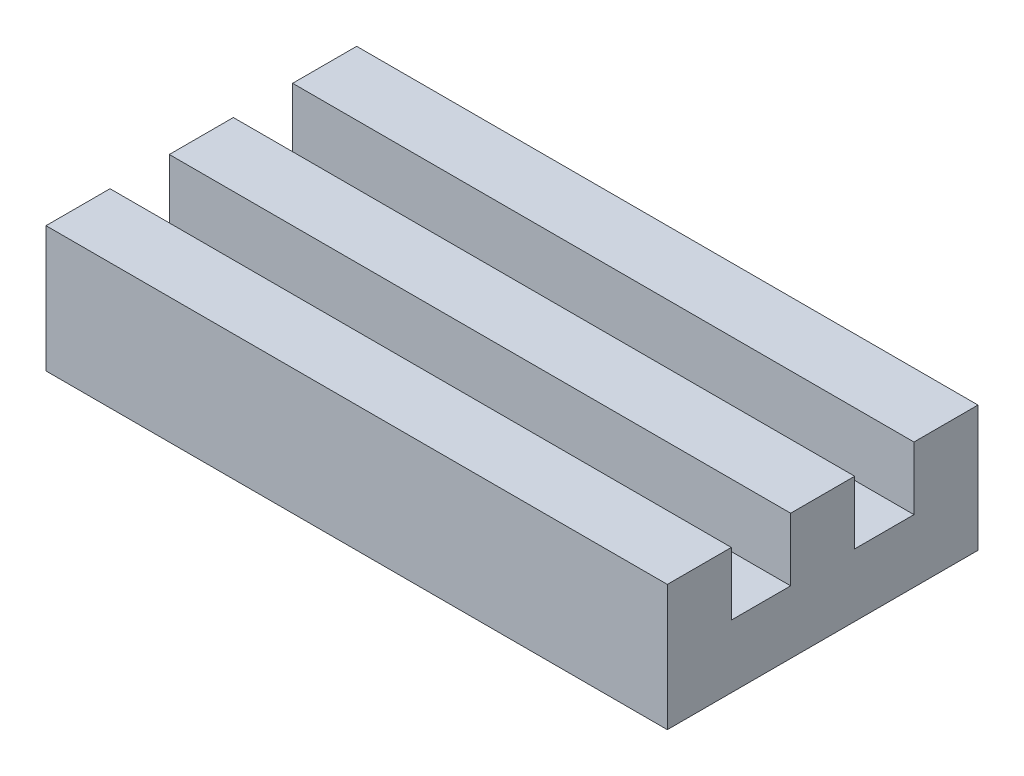
ISO-10303-21;
HEADER;
FILE_DESCRIPTION(('STEP AP214'),'2;1');
FILE_NAME('part.step','',(''),(''),'','','');
FILE_SCHEMA(('AUTOMOTIVE_DESIGN { 1 0 10303 214 1 1 1 1 }'));
ENDSEC;
DATA;
#1=APPLICATION_CONTEXT('core data for automotive mechanical design processes');
#2=APPLICATION_PROTOCOL_DEFINITION('international standard','automotive_design',2000,#1);
#3=PRODUCT_CONTEXT('',#1,'mechanical');
#4=PRODUCT('Part','Part','',(#3));
#5=PRODUCT_RELATED_PRODUCT_CATEGORY('part','',(#4));
#6=PRODUCT_DEFINITION_FORMATION('','',#4);
#7=PRODUCT_DEFINITION_CONTEXT('part definition',#1,'design');
#8=PRODUCT_DEFINITION('design','',#6,#7);
#9=PRODUCT_DEFINITION_SHAPE('','',#8);
#10=(LENGTH_UNIT() NAMED_UNIT(*) SI_UNIT(.MILLI.,.METRE.));
#11=(NAMED_UNIT(*) PLANE_ANGLE_UNIT() SI_UNIT($,.RADIAN.));
#12=(NAMED_UNIT(*) SI_UNIT($,.STERADIAN.) SOLID_ANGLE_UNIT());
#13=UNCERTAINTY_MEASURE_WITH_UNIT(LENGTH_MEASURE(1.E-05),#10,'distance_accuracy_value','');
#14=(GEOMETRIC_REPRESENTATION_CONTEXT(3) GLOBAL_UNCERTAINTY_ASSIGNED_CONTEXT((#13)) GLOBAL_UNIT_ASSIGNED_CONTEXT((#10,
#11,#12)) REPRESENTATION_CONTEXT('',''));
#15=CARTESIAN_POINT('',(0.,0.,0.));
#16=DIRECTION('',(0.,0.,1.));
#17=DIRECTION('',(1.,0.,0.));
#18=AXIS2_PLACEMENT_3D('',#15,#16,#17);
#19=CARTESIAN_POINT('',(15.8,3.2,-7.9));
#20=DIRECTION('',(-1.,0.,0.));
#21=DIRECTION('',(0.,0.,1.));
#22=AXIS2_PLACEMENT_3D('',#19,#20,#21);
#23=PLANE('',#22);
#24=DIRECTION('',(0.,0.,-1.));
#25=VECTOR('',#24,1.);
#26=CARTESIAN_POINT('',(15.8,3.2,-7.9));
#27=LINE('',#26,#25);
#28=CARTESIAN_POINT('',(15.8,3.2,-3.13588142135029));
#29=VERTEX_POINT('',#28);
#30=CARTESIAN_POINT('',(15.8,3.2,-4.76411857864971));
#31=VERTEX_POINT('',#30);
#32=EDGE_CURVE('E189',#29,#31,#27,.T.);
#33=ORIENTED_EDGE('',*,*,#32,.F.);
#34=DIRECTION('',(0.,1.,0.));
#35=VECTOR('',#34,1.);
#36=CARTESIAN_POINT('',(15.8,0.,-3.13588142135029));
#37=LINE('',#36,#35);
#38=CARTESIAN_POINT('',(15.8,1.6,-3.13588142135029));
#39=VERTEX_POINT('',#38);
#40=EDGE_CURVE('E148',#39,#29,#37,.T.);
#41=ORIENTED_EDGE('',*,*,#40,.F.);
#42=DIRECTION('',(0.,0.,-1.));
#43=VECTOR('',#42,1.);
#44=CARTESIAN_POINT('',(15.8,1.6,0.));
#45=LINE('',#44,#43);
#46=CARTESIAN_POINT('',(15.8,1.6,-1.62823715729943));
#47=VERTEX_POINT('',#46);
#48=EDGE_CURVE('E154',#47,#39,#45,.T.);
#49=ORIENTED_EDGE('',*,*,#48,.F.);
#50=DIRECTION('',(0.,-1.,0.));
#51=VECTOR('',#50,1.);
#52=CARTESIAN_POINT('',(15.8,0.,-1.62823715729943));
#53=LINE('',#52,#51);
#54=CARTESIAN_POINT('',(15.8,3.2,-1.62823715729943));
#55=VERTEX_POINT('',#54);
#56=EDGE_CURVE('E124',#55,#47,#53,.T.);
#57=ORIENTED_EDGE('',*,*,#56,.F.);
#58=CARTESIAN_POINT('',(15.8,3.2,0.));
#59=VERTEX_POINT('',#58);
#60=EDGE_CURVE('E185',#59,#55,#27,.T.);
#61=ORIENTED_EDGE('',*,*,#60,.F.);
#62=DIRECTION('',(0.,-1.,0.));
#63=VECTOR('',#62,1.);
#64=CARTESIAN_POINT('',(15.8,3.2,0.));
#65=LINE('',#64,#63);
#66=CARTESIAN_POINT('',(15.8,0.,0.));
#67=VERTEX_POINT('',#66);
#68=EDGE_CURVE('E11',#59,#67,#65,.T.);
#69=ORIENTED_EDGE('',*,*,#68,.T.);
#70=DIRECTION('',(0.,0.,-1.));
#71=VECTOR('',#70,1.);
#72=CARTESIAN_POINT('',(15.8,0.,-7.9));
#73=LINE('',#72,#71);
#74=CARTESIAN_POINT('',(15.8,0.,-7.9));
#75=VERTEX_POINT('',#74);
#76=EDGE_CURVE('E198',#67,#75,#73,.T.);
#77=ORIENTED_EDGE('',*,*,#76,.T.);
#78=DIRECTION('',(0.,-1.,0.));
#79=VECTOR('',#78,1.);
#80=CARTESIAN_POINT('',(15.8,3.2,-7.9));
#81=LINE('',#80,#79);
#82=CARTESIAN_POINT('',(15.8,3.2,-7.9));
#83=VERTEX_POINT('',#82);
#84=EDGE_CURVE('E40',#83,#75,#81,.T.);
#85=ORIENTED_EDGE('',*,*,#84,.F.);
#86=CARTESIAN_POINT('',(15.8,3.2,-6.27176284270057));
#87=VERTEX_POINT('',#86);
#88=EDGE_CURVE('E183',#87,#83,#27,.T.);
#89=ORIENTED_EDGE('',*,*,#88,.F.);
#90=DIRECTION('',(0.,-1.,0.));
#91=VECTOR('',#90,1.);
#92=CARTESIAN_POINT('',(15.8,0.,-6.27176284270057));
#93=LINE('',#92,#91);
#94=CARTESIAN_POINT('',(15.8,1.6,-6.27176284270057));
#95=VERTEX_POINT('',#94);
#96=EDGE_CURVE('E55',#87,#95,#93,.T.);
#97=ORIENTED_EDGE('',*,*,#96,.T.);
#98=DIRECTION('',(0.,0.,1.));
#99=VECTOR('',#98,1.);
#100=CARTESIAN_POINT('',(15.8,1.6,0.));
#101=LINE('',#100,#99);
#102=CARTESIAN_POINT('',(15.8,1.6,-4.76411857864971));
#103=VERTEX_POINT('',#102);
#104=EDGE_CURVE('E158',#95,#103,#101,.T.);
#105=ORIENTED_EDGE('',*,*,#104,.T.);
#106=DIRECTION('',(0.,1.,0.));
#107=VECTOR('',#106,1.);
#108=CARTESIAN_POINT('',(15.8,0.,-4.76411857864971));
#109=LINE('',#108,#107);
#110=EDGE_CURVE('E155',#103,#31,#109,.T.);
#111=ORIENTED_EDGE('',*,*,#110,.T.);
#112=EDGE_LOOP('',(#33,#41,#49,#57,#61,#69,#77,#85,#89,#97,#105,#111));
#113=FACE_BOUND('',#112,.T.);
#114=ADVANCED_FACE('F32',(#113),#23,.F.);
#115=CARTESIAN_POINT('',(0.,3.2,0.));
#116=DIRECTION('',(1.,0.,0.));
#117=DIRECTION('',(0.,0.,-1.));
#118=AXIS2_PLACEMENT_3D('',#115,#116,#117);
#119=PLANE('',#118);
#120=DIRECTION('',(0.,0.,1.));
#121=VECTOR('',#120,1.);
#122=CARTESIAN_POINT('',(0.,1.6,0.));
#123=LINE('',#122,#121);
#124=CARTESIAN_POINT('',(0.,1.6,-3.13588142135029));
#125=VERTEX_POINT('',#124);
#126=CARTESIAN_POINT('',(0.,1.6,-1.62823715729943));
#127=VERTEX_POINT('',#126);
#128=EDGE_CURVE('E131',#125,#127,#123,.T.);
#129=ORIENTED_EDGE('',*,*,#128,.F.);
#130=DIRECTION('',(0.,-1.,0.));
#131=VECTOR('',#130,1.);
#132=CARTESIAN_POINT('',(0.,0.,-3.13588142135029));
#133=LINE('',#132,#131);
#134=CARTESIAN_POINT('',(0.,3.2,-3.13588142135029));
#135=VERTEX_POINT('',#134);
#136=EDGE_CURVE('E128',#135,#125,#133,.T.);
#137=ORIENTED_EDGE('',*,*,#136,.F.);
#138=DIRECTION('',(0.,0.,1.));
#139=VECTOR('',#138,1.);
#140=CARTESIAN_POINT('',(0.,3.2,0.));
#141=LINE('',#140,#139);
#142=CARTESIAN_POINT('',(0.,3.2,-4.76411857864971));
#143=VERTEX_POINT('',#142);
#144=EDGE_CURVE('E195',#143,#135,#141,.T.);
#145=ORIENTED_EDGE('',*,*,#144,.F.);
#146=DIRECTION('',(0.,-1.,0.));
#147=VECTOR('',#146,1.);
#148=CARTESIAN_POINT('',(0.,0.,-4.76411857864971));
#149=LINE('',#148,#147);
#150=CARTESIAN_POINT('',(0.,1.6,-4.76411857864971));
#151=VERTEX_POINT('',#150);
#152=EDGE_CURVE('E166',#143,#151,#149,.T.);
#153=ORIENTED_EDGE('',*,*,#152,.T.);
#154=DIRECTION('',(0.,0.,-1.));
#155=VECTOR('',#154,1.);
#156=CARTESIAN_POINT('',(0.,1.6,0.));
#157=LINE('',#156,#155);
#158=CARTESIAN_POINT('',(0.,1.6,-6.27176284270057));
#159=VERTEX_POINT('',#158);
#160=EDGE_CURVE('E163',#151,#159,#157,.T.);
#161=ORIENTED_EDGE('',*,*,#160,.T.);
#162=DIRECTION('',(0.,1.,0.));
#163=VECTOR('',#162,1.);
#164=CARTESIAN_POINT('',(0.,0.,-6.27176284270057));
#165=LINE('',#164,#163);
#166=CARTESIAN_POINT('',(0.,3.2,-6.27176284270057));
#167=VERTEX_POINT('',#166);
#168=EDGE_CURVE('E160',#159,#167,#165,.T.);
#169=ORIENTED_EDGE('',*,*,#168,.T.);
#170=CARTESIAN_POINT('',(0.,3.2,-7.9));
#171=VERTEX_POINT('',#170);
#172=EDGE_CURVE('E191',#171,#167,#141,.T.);
#173=ORIENTED_EDGE('',*,*,#172,.F.);
#174=DIRECTION('',(0.,-1.,0.));
#175=VECTOR('',#174,1.);
#176=CARTESIAN_POINT('',(0.,3.2,-7.9));
#177=LINE('',#176,#175);
#178=CARTESIAN_POINT('',(0.,0.,-7.9));
#179=VERTEX_POINT('',#178);
#180=EDGE_CURVE('E205',#171,#179,#177,.T.);
#181=ORIENTED_EDGE('',*,*,#180,.T.);
#182=DIRECTION('',(0.,0.,1.));
#183=VECTOR('',#182,1.);
#184=CARTESIAN_POINT('',(0.,0.,0.));
#185=LINE('',#184,#183);
#186=CARTESIAN_POINT('',(0.,0.,0.));
#187=VERTEX_POINT('',#186);
#188=EDGE_CURVE('E184',#179,#187,#185,.T.);
#189=ORIENTED_EDGE('',*,*,#188,.T.);
#190=DIRECTION('',(0.,-1.,0.));
#191=VECTOR('',#190,1.);
#192=CARTESIAN_POINT('',(0.,3.2,0.));
#193=LINE('',#192,#191);
#194=CARTESIAN_POINT('',(0.,3.2,0.));
#195=VERTEX_POINT('',#194);
#196=EDGE_CURVE('E194',#195,#187,#193,.T.);
#197=ORIENTED_EDGE('',*,*,#196,.F.);
#198=CARTESIAN_POINT('',(0.,3.2,-1.62823715729943));
#199=VERTEX_POINT('',#198);
#200=EDGE_CURVE('E142',#199,#195,#141,.T.);
#201=ORIENTED_EDGE('',*,*,#200,.F.);
#202=DIRECTION('',(0.,1.,0.));
#203=VECTOR('',#202,1.);
#204=CARTESIAN_POINT('',(0.,0.,-1.62823715729943));
#205=LINE('',#204,#203);
#206=EDGE_CURVE('E47',#127,#199,#205,.T.);
#207=ORIENTED_EDGE('',*,*,#206,.F.);
#208=EDGE_LOOP('',(#129,#137,#145,#153,#161,#169,#173,#181,#189,#197,#201,#207));
#209=FACE_BOUND('',#208,.T.);
#210=ADVANCED_FACE('F140',(#209),#119,.F.);
#211=CARTESIAN_POINT('',(0.,3.2,0.));
#212=DIRECTION('',(0.,-1.,0.));
#213=DIRECTION('',(0.,0.,-1.));
#214=AXIS2_PLACEMENT_3D('',#211,#212,#213);
#215=PLANE('',#214);
#216=ORIENTED_EDGE('',*,*,#144,.T.);
#217=DIRECTION('',(-1.,0.,0.));
#218=VECTOR('',#217,1.);
#219=CARTESIAN_POINT('',(17.9984065199425,3.2,-3.13588142135029));
#220=LINE('',#219,#218);
#221=EDGE_CURVE('E149',#29,#135,#220,.T.);
#222=ORIENTED_EDGE('',*,*,#221,.F.);
#223=ORIENTED_EDGE('',*,*,#32,.T.);
#224=DIRECTION('',(-1.,0.,0.));
#225=VECTOR('',#224,1.);
#226=CARTESIAN_POINT('',(17.9984065199425,3.2,-4.76411857864971));
#227=LINE('',#226,#225);
#228=EDGE_CURVE('E172',#31,#143,#227,.T.);
#229=ORIENTED_EDGE('',*,*,#228,.T.);
#230=EDGE_LOOP('',(#216,#222,#223,#229));
#231=FACE_BOUND('',#230,.T.);
#232=ADVANCED_FACE('F230',(#231),#215,.F.);
#233=ORIENTED_EDGE('',*,*,#60,.T.);
#234=DIRECTION('',(-1.,0.,0.));
#235=VECTOR('',#234,1.);
#236=CARTESIAN_POINT('',(17.9984065199425,3.2,-1.62823715729943));
#237=LINE('',#236,#235);
#238=EDGE_CURVE('E127',#55,#199,#237,.T.);
#239=ORIENTED_EDGE('',*,*,#238,.T.);
#240=ORIENTED_EDGE('',*,*,#200,.T.);
#241=DIRECTION('',(1.,0.,0.));
#242=VECTOR('',#241,1.);
#243=CARTESIAN_POINT('',(0.,3.2,0.));
#244=LINE('',#243,#242);
#245=EDGE_CURVE('E180',#195,#59,#244,.T.);
#246=ORIENTED_EDGE('',*,*,#245,.T.);
#247=EDGE_LOOP('',(#233,#239,#240,#246));
#248=FACE_BOUND('',#247,.T.);
#249=ADVANCED_FACE('F225',(#248),#215,.F.);
#250=DIRECTION('',(-1.,0.,0.));
#251=VECTOR('',#250,1.);
#252=CARTESIAN_POINT('',(17.9984065199425,3.2,-6.27176284270057));
#253=LINE('',#252,#251);
#254=EDGE_CURVE('E170',#87,#167,#253,.T.);
#255=ORIENTED_EDGE('',*,*,#254,.F.);
#256=ORIENTED_EDGE('',*,*,#88,.T.);
#257=DIRECTION('',(-1.,0.,0.));
#258=VECTOR('',#257,1.);
#259=CARTESIAN_POINT('',(0.,3.2,-7.9));
#260=LINE('',#259,#258);
#261=EDGE_CURVE('E188',#83,#171,#260,.T.);
#262=ORIENTED_EDGE('',*,*,#261,.T.);
#263=ORIENTED_EDGE('',*,*,#172,.T.);
#264=EDGE_LOOP('',(#255,#256,#262,#263));
#265=FACE_BOUND('',#264,.T.);
#266=ADVANCED_FACE('F250',(#265),#215,.F.);
#267=CARTESIAN_POINT('',(0.,3.2,0.));
#268=DIRECTION('',(0.,0.,-1.));
#269=DIRECTION('',(-1.,0.,0.));
#270=AXIS2_PLACEMENT_3D('',#267,#268,#269);
#271=PLANE('',#270);
#272=DIRECTION('',(1.,0.,0.));
#273=VECTOR('',#272,1.);
#274=CARTESIAN_POINT('',(0.,0.,0.));
#275=LINE('',#274,#273);
#276=EDGE_CURVE('E153',#187,#67,#275,.T.);
#277=ORIENTED_EDGE('',*,*,#276,.T.);
#278=ORIENTED_EDGE('',*,*,#68,.F.);
#279=ORIENTED_EDGE('',*,*,#245,.F.);
#280=ORIENTED_EDGE('',*,*,#196,.T.);
#281=EDGE_LOOP('',(#277,#278,#279,#280));
#282=FACE_BOUND('',#281,.T.);
#283=ADVANCED_FACE('F34',(#282),#271,.F.);
#284=CARTESIAN_POINT('',(0.,3.2,-7.9));
#285=DIRECTION('',(0.,0.,1.));
#286=DIRECTION('',(1.,0.,0.));
#287=AXIS2_PLACEMENT_3D('',#284,#285,#286);
#288=PLANE('',#287);
#289=DIRECTION('',(-1.,0.,0.));
#290=VECTOR('',#289,1.);
#291=CARTESIAN_POINT('',(0.,0.,-7.9));
#292=LINE('',#291,#290);
#293=EDGE_CURVE('E200',#75,#179,#292,.T.);
#294=ORIENTED_EDGE('',*,*,#293,.T.);
#295=ORIENTED_EDGE('',*,*,#180,.F.);
#296=ORIENTED_EDGE('',*,*,#261,.F.);
#297=ORIENTED_EDGE('',*,*,#84,.T.);
#298=EDGE_LOOP('',(#294,#295,#296,#297));
#299=FACE_BOUND('',#298,.T.);
#300=ADVANCED_FACE('F212',(#299),#288,.F.);
#301=CARTESIAN_POINT('',(0.,0.,0.));
#302=DIRECTION('',(0.,-1.,0.));
#303=DIRECTION('',(0.,0.,-1.));
#304=AXIS2_PLACEMENT_3D('',#301,#302,#303);
#305=PLANE('',#304);
#306=ORIENTED_EDGE('',*,*,#276,.F.);
#307=ORIENTED_EDGE('',*,*,#188,.F.);
#308=ORIENTED_EDGE('',*,*,#293,.F.);
#309=ORIENTED_EDGE('',*,*,#76,.F.);
#310=EDGE_LOOP('',(#306,#307,#308,#309));
#311=FACE_BOUND('',#310,.T.);
#312=ADVANCED_FACE('F219',(#311),#305,.T.);
#313=CARTESIAN_POINT('',(17.9984065199425,1.6,0.));
#314=DIRECTION('',(0.,1.,0.));
#315=DIRECTION('',(0.,0.,1.));
#316=AXIS2_PLACEMENT_3D('',#313,#314,#315);
#317=PLANE('',#316);
#318=DIRECTION('',(-1.,0.,0.));
#319=VECTOR('',#318,1.);
#320=CARTESIAN_POINT('',(17.9984065199425,1.6,-6.27176284270057));
#321=LINE('',#320,#319);
#322=EDGE_CURVE('E169',#95,#159,#321,.T.);
#323=ORIENTED_EDGE('',*,*,#322,.T.);
#324=ORIENTED_EDGE('',*,*,#160,.F.);
#325=DIRECTION('',(-1.,0.,0.));
#326=VECTOR('',#325,1.);
#327=CARTESIAN_POINT('',(17.9984065199425,1.6,-4.76411857864971));
#328=LINE('',#327,#326);
#329=EDGE_CURVE('E175',#103,#151,#328,.T.);
#330=ORIENTED_EDGE('',*,*,#329,.F.);
#331=ORIENTED_EDGE('',*,*,#104,.F.);
#332=EDGE_LOOP('',(#323,#324,#330,#331));
#333=FACE_BOUND('',#332,.T.);
#334=ADVANCED_FACE('F247',(#333),#317,.T.);
#335=CARTESIAN_POINT('',(17.9984065199425,0.,-4.76411857864971));
#336=DIRECTION('',(0.,0.,-1.));
#337=DIRECTION('',(-1.,0.,0.));
#338=AXIS2_PLACEMENT_3D('',#335,#336,#337);
#339=PLANE('',#338);
#340=ORIENTED_EDGE('',*,*,#329,.T.);
#341=ORIENTED_EDGE('',*,*,#152,.F.);
#342=ORIENTED_EDGE('',*,*,#228,.F.);
#343=ORIENTED_EDGE('',*,*,#110,.F.);
#344=EDGE_LOOP('',(#340,#341,#342,#343));
#345=FACE_BOUND('',#344,.T.);
#346=ADVANCED_FACE('F254',(#345),#339,.T.);
#347=CARTESIAN_POINT('',(17.9984065199425,0.,-6.27176284270057));
#348=DIRECTION('',(0.,0.,1.));
#349=DIRECTION('',(1.,0.,0.));
#350=AXIS2_PLACEMENT_3D('',#347,#348,#349);
#351=PLANE('',#350);
#352=ORIENTED_EDGE('',*,*,#254,.T.);
#353=ORIENTED_EDGE('',*,*,#168,.F.);
#354=ORIENTED_EDGE('',*,*,#322,.F.);
#355=ORIENTED_EDGE('',*,*,#96,.F.);
#356=EDGE_LOOP('',(#352,#353,#354,#355));
#357=FACE_BOUND('',#356,.T.);
#358=ADVANCED_FACE('F251',(#357),#351,.T.);
#359=CARTESIAN_POINT('',(17.9984065199425,1.6,0.));
#360=DIRECTION('',(0.,-1.,0.));
#361=DIRECTION('',(0.,0.,-1.));
#362=AXIS2_PLACEMENT_3D('',#359,#360,#361);
#363=PLANE('',#362);
#364=ORIENTED_EDGE('',*,*,#48,.T.);
#365=DIRECTION('',(-1.,0.,0.));
#366=VECTOR('',#365,1.);
#367=CARTESIAN_POINT('',(17.9984065199425,1.6,-3.13588142135029));
#368=LINE('',#367,#366);
#369=EDGE_CURVE('E134',#39,#125,#368,.T.);
#370=ORIENTED_EDGE('',*,*,#369,.T.);
#371=ORIENTED_EDGE('',*,*,#128,.T.);
#372=DIRECTION('',(-1.,0.,0.));
#373=VECTOR('',#372,1.);
#374=CARTESIAN_POINT('',(17.9984065199425,1.6,-1.62823715729943));
#375=LINE('',#374,#373);
#376=EDGE_CURVE('E120',#47,#127,#375,.T.);
#377=ORIENTED_EDGE('',*,*,#376,.F.);
#378=EDGE_LOOP('',(#364,#370,#371,#377));
#379=FACE_BOUND('',#378,.T.);
#380=ADVANCED_FACE('F132',(#379),#363,.F.);
#381=CARTESIAN_POINT('',(17.9984065199425,0.,-3.13588142135029));
#382=DIRECTION('',(0.,0.,-1.));
#383=DIRECTION('',(-1.,0.,0.));
#384=AXIS2_PLACEMENT_3D('',#381,#382,#383);
#385=PLANE('',#384);
#386=ORIENTED_EDGE('',*,*,#40,.T.);
#387=ORIENTED_EDGE('',*,*,#221,.T.);
#388=ORIENTED_EDGE('',*,*,#136,.T.);
#389=ORIENTED_EDGE('',*,*,#369,.F.);
#390=EDGE_LOOP('',(#386,#387,#388,#389));
#391=FACE_BOUND('',#390,.T.);
#392=ADVANCED_FACE('F234',(#391),#385,.F.);
#393=CARTESIAN_POINT('',(17.9984065199425,0.,-1.62823715729943));
#394=DIRECTION('',(0.,0.,1.));
#395=DIRECTION('',(1.,0.,0.));
#396=AXIS2_PLACEMENT_3D('',#393,#394,#395);
#397=PLANE('',#396);
#398=ORIENTED_EDGE('',*,*,#56,.T.);
#399=ORIENTED_EDGE('',*,*,#376,.T.);
#400=ORIENTED_EDGE('',*,*,#206,.T.);
#401=ORIENTED_EDGE('',*,*,#238,.F.);
#402=EDGE_LOOP('',(#398,#399,#400,#401));
#403=FACE_BOUND('',#402,.T.);
#404=ADVANCED_FACE('F122',(#403),#397,.F.);
#405=CLOSED_SHELL('',(#114,#210,#232,#249,#266,#283,#300,#312,#334,#346,#358,#380,#392,#404));
#406=MANIFOLD_SOLID_BREP('B2',#405);
#407=ADVANCED_BREP_SHAPE_REPRESENTATION('',(#18,#406),#14);
#408=SHAPE_DEFINITION_REPRESENTATION(#9,#407);
ENDSEC;
END-ISO-10303-21;
